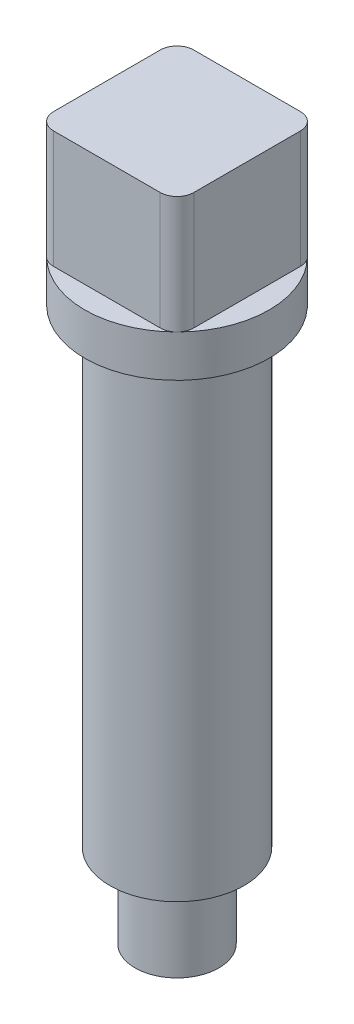
ISO-10303-21;
HEADER;
FILE_DESCRIPTION(('STEP AP214'),'2;1');
FILE_NAME('part.step','',(''),(''),'','','');
FILE_SCHEMA(('AUTOMOTIVE_DESIGN { 1 0 10303 214 1 1 1 1 }'));
ENDSEC;
DATA;
#1=APPLICATION_CONTEXT('core data for automotive mechanical design processes');
#2=APPLICATION_PROTOCOL_DEFINITION('international standard','automotive_design',2000,#1);
#3=PRODUCT_CONTEXT('',#1,'mechanical');
#4=PRODUCT('Part','Part','',(#3));
#5=PRODUCT_RELATED_PRODUCT_CATEGORY('part','',(#4));
#6=PRODUCT_DEFINITION_FORMATION('','',#4);
#7=PRODUCT_DEFINITION_CONTEXT('part definition',#1,'design');
#8=PRODUCT_DEFINITION('design','',#6,#7);
#9=PRODUCT_DEFINITION_SHAPE('','',#8);
#10=(LENGTH_UNIT() NAMED_UNIT(*) SI_UNIT(.MILLI.,.METRE.));
#11=(NAMED_UNIT(*) PLANE_ANGLE_UNIT() SI_UNIT($,.RADIAN.));
#12=(NAMED_UNIT(*) SI_UNIT($,.STERADIAN.) SOLID_ANGLE_UNIT());
#13=UNCERTAINTY_MEASURE_WITH_UNIT(LENGTH_MEASURE(1.E-05),#10,'distance_accuracy_value','');
#14=(GEOMETRIC_REPRESENTATION_CONTEXT(3) GLOBAL_UNCERTAINTY_ASSIGNED_CONTEXT((#13)) GLOBAL_UNIT_ASSIGNED_CONTEXT((#10,
#11,#12)) REPRESENTATION_CONTEXT('',''));
#15=CARTESIAN_POINT('',(0.,0.,0.));
#16=DIRECTION('',(0.,0.,1.));
#17=DIRECTION('',(1.,0.,0.));
#18=AXIS2_PLACEMENT_3D('',#15,#16,#17);
#19=CARTESIAN_POINT('',(11.,71.,0.));
#20=DIRECTION('',(0.,-1.,0.));
#21=DIRECTION('',(1.,0.,0.));
#22=AXIS2_PLACEMENT_3D('',#19,#20,#21);
#23=PLANE('',#22);
#24=CARTESIAN_POINT('',(6.36396103067893,71.,6.36396103067893));
#25=DIRECTION('',(0.,1.,0.));
#26=DIRECTION('',(-1.,0.,0.));
#27=AXIS2_PLACEMENT_3D('',#24,#25,#26);
#28=CIRCLE('',#27,2.);
#29=CARTESIAN_POINT('',(6.36396103067893,71.,8.36396103067893));
#30=VERTEX_POINT('',#29);
#31=CARTESIAN_POINT('',(7.77817459305202,71.,7.77817459305203));
#32=VERTEX_POINT('',#31);
#33=EDGE_CURVE('E63',#30,#32,#28,.T.);
#34=ORIENTED_EDGE('',*,*,#33,.F.);
#35=DIRECTION('',(1.,0.,0.));
#36=VECTOR('',#35,1.);
#37=CARTESIAN_POINT('',(-6.36396103067893,71.,8.36396103067893));
#38=LINE('',#37,#36);
#39=CARTESIAN_POINT('',(-6.36396103067893,71.,8.36396103067893));
#40=VERTEX_POINT('',#39);
#41=EDGE_CURVE('E73',#40,#30,#38,.T.);
#42=ORIENTED_EDGE('',*,*,#41,.F.);
#43=CARTESIAN_POINT('',(-6.36396103067893,71.,6.36396103067893));
#44=DIRECTION('',(0.,1.,0.));
#45=DIRECTION('',(-1.,0.,0.));
#46=AXIS2_PLACEMENT_3D('',#43,#44,#45);
#47=CIRCLE('',#46,2.);
#48=CARTESIAN_POINT('',(-7.77817459305203,71.,7.77817459305202));
#49=VERTEX_POINT('',#48);
#50=EDGE_CURVE('E64',#49,#40,#47,.T.);
#51=ORIENTED_EDGE('',*,*,#50,.F.);
#52=CARTESIAN_POINT('',(0.,71.,0.));
#53=DIRECTION('',(0.,1.,0.));
#54=DIRECTION('',(-1.,0.,0.));
#55=AXIS2_PLACEMENT_3D('',#52,#53,#54);
#56=CIRCLE('',#55,11.);
#57=EDGE_CURVE('E169',#49,#32,#56,.T.);
#58=ORIENTED_EDGE('',*,*,#57,.T.);
#59=EDGE_LOOP('',(#34,#42,#51,#58));
#60=FACE_BOUND('',#59,.T.);
#61=ADVANCED_FACE('F52',(#60),#23,.F.);
#62=CARTESIAN_POINT('',(8.36396103067893,71.,6.36396103067893));
#63=VERTEX_POINT('',#62);
#64=EDGE_CURVE('E11',#32,#63,#28,.T.);
#65=ORIENTED_EDGE('',*,*,#64,.F.);
#66=CARTESIAN_POINT('',(7.77817459305202,71.,-7.77817459305202));
#67=VERTEX_POINT('',#66);
#68=EDGE_CURVE('E173',#32,#67,#56,.T.);
#69=ORIENTED_EDGE('',*,*,#68,.T.);
#70=CARTESIAN_POINT('',(6.36396103067893,71.,-6.36396103067893));
#71=DIRECTION('',(0.,1.,0.));
#72=DIRECTION('',(1.,0.,0.));
#73=AXIS2_PLACEMENT_3D('',#70,#71,#72);
#74=CIRCLE('',#73,2.);
#75=CARTESIAN_POINT('',(8.36396103067893,71.,-6.36396103067893));
#76=VERTEX_POINT('',#75);
#77=EDGE_CURVE('E196',#76,#67,#74,.T.);
#78=ORIENTED_EDGE('',*,*,#77,.F.);
#79=DIRECTION('',(0.,0.,-1.));
#80=VECTOR('',#79,1.);
#81=CARTESIAN_POINT('',(8.36396103067893,71.,-6.36396103067893));
#82=LINE('',#81,#80);
#83=EDGE_CURVE('E152',#63,#76,#82,.T.);
#84=ORIENTED_EDGE('',*,*,#83,.F.);
#85=EDGE_LOOP('',(#65,#69,#78,#84));
#86=FACE_BOUND('',#85,.T.);
#87=ADVANCED_FACE('F267',(#86),#23,.F.);
#88=CARTESIAN_POINT('',(-8.36396103067894,71.,6.36396103067893));
#89=VERTEX_POINT('',#88);
#90=EDGE_CURVE('E214',#89,#49,#47,.T.);
#91=ORIENTED_EDGE('',*,*,#90,.F.);
#92=DIRECTION('',(0.,0.,1.));
#93=VECTOR('',#92,1.);
#94=CARTESIAN_POINT('',(-8.36396103067893,71.,-6.36396103067893));
#95=LINE('',#94,#93);
#96=CARTESIAN_POINT('',(-8.36396103067893,71.,-6.36396103067893));
#97=VERTEX_POINT('',#96);
#98=EDGE_CURVE('E209',#97,#89,#95,.T.);
#99=ORIENTED_EDGE('',*,*,#98,.F.);
#100=CARTESIAN_POINT('',(-6.36396103067893,71.,-6.36396103067893));
#101=DIRECTION('',(0.,1.,0.));
#102=DIRECTION('',(-1.,0.,0.));
#103=AXIS2_PLACEMENT_3D('',#100,#101,#102);
#104=CIRCLE('',#103,2.);
#105=CARTESIAN_POINT('',(-7.77817459305203,71.,-7.77817459305202));
#106=VERTEX_POINT('',#105);
#107=EDGE_CURVE('E198',#106,#97,#104,.T.);
#108=ORIENTED_EDGE('',*,*,#107,.F.);
#109=EDGE_CURVE('E161',#106,#49,#56,.T.);
#110=ORIENTED_EDGE('',*,*,#109,.T.);
#111=EDGE_LOOP('',(#91,#99,#108,#110));
#112=FACE_BOUND('',#111,.T.);
#113=ADVANCED_FACE('F254',(#112),#23,.F.);
#114=CARTESIAN_POINT('',(6.36396103067893,71.,-8.36396103067893));
#115=VERTEX_POINT('',#114);
#116=EDGE_CURVE('E157',#67,#115,#74,.T.);
#117=ORIENTED_EDGE('',*,*,#116,.F.);
#118=EDGE_CURVE('E167',#67,#106,#56,.T.);
#119=ORIENTED_EDGE('',*,*,#118,.T.);
#120=CARTESIAN_POINT('',(-6.36396103067893,71.,-8.36396103067893));
#121=VERTEX_POINT('',#120);
#122=EDGE_CURVE('E205',#121,#106,#104,.T.);
#123=ORIENTED_EDGE('',*,*,#122,.F.);
#124=DIRECTION('',(-1.,0.,0.));
#125=VECTOR('',#124,1.);
#126=CARTESIAN_POINT('',(-6.36396103067893,71.,-8.36396103067893));
#127=LINE('',#126,#125);
#128=EDGE_CURVE('E206',#115,#121,#127,.T.);
#129=ORIENTED_EDGE('',*,*,#128,.F.);
#130=EDGE_LOOP('',(#117,#119,#123,#129));
#131=FACE_BOUND('',#130,.T.);
#132=ADVANCED_FACE('F264',(#131),#23,.F.);
#133=CARTESIAN_POINT('',(0.,0.,0.));
#134=DIRECTION('',(0.,1.,0.));
#135=DIRECTION('',(-1.,0.,0.));
#136=AXIS2_PLACEMENT_3D('',#133,#134,#135);
#137=PLANE('',#136);
#138=CARTESIAN_POINT('',(0.,0.,0.));
#139=DIRECTION('',(0.,1.,0.));
#140=DIRECTION('',(-1.,0.,0.));
#141=AXIS2_PLACEMENT_3D('',#138,#139,#140);
#142=CIRCLE('',#141,5.);
#143=CARTESIAN_POINT('',(-5.,0.,0.));
#144=VERTEX_POINT('',#143);
#145=EDGE_CURVE('E60',#144,#144,#142,.T.);
#146=ORIENTED_EDGE('',*,*,#145,.F.);
#147=EDGE_LOOP('',(#146));
#148=FACE_BOUND('',#147,.T.);
#149=ADVANCED_FACE('F54',(#148),#137,.F.);
#150=CARTESIAN_POINT('',(0.,71.,0.));
#151=DIRECTION('',(0.,1.,0.));
#152=DIRECTION('',(-1.,0.,0.));
#153=AXIS2_PLACEMENT_3D('',#150,#151,#152);
#154=CYLINDRICAL_SURFACE('',#153,5.);
#155=CARTESIAN_POINT('',(0.,10.,0.));
#156=DIRECTION('',(0.,1.,0.));
#157=DIRECTION('',(-1.,0.,0.));
#158=AXIS2_PLACEMENT_3D('',#155,#156,#157);
#159=CIRCLE('',#158,5.00000000000001);
#160=CARTESIAN_POINT('',(-5.00000000000001,10.,0.));
#161=VERTEX_POINT('',#160);
#162=EDGE_CURVE('E187',#161,#161,#159,.T.);
#163=ORIENTED_EDGE('',*,*,#162,.F.);
#164=EDGE_LOOP('',(#163));
#165=FACE_BOUND('',#164,.T.);
#166=ORIENTED_EDGE('',*,*,#145,.T.);
#167=EDGE_LOOP('',(#166));
#168=FACE_BOUND('',#167,.T.);
#169=ADVANCED_FACE('F319',(#165,#168),#154,.T.);
#170=CARTESIAN_POINT('',(5.,10.,0.));
#171=DIRECTION('',(0.,1.,0.));
#172=DIRECTION('',(-1.,0.,0.));
#173=AXIS2_PLACEMENT_3D('',#170,#171,#172);
#174=PLANE('',#173);
#175=CARTESIAN_POINT('',(0.,10.,0.));
#176=DIRECTION('',(0.,1.,0.));
#177=DIRECTION('',(-1.,0.,0.));
#178=AXIS2_PLACEMENT_3D('',#175,#176,#177);
#179=CIRCLE('',#178,8.00000000000001);
#180=CARTESIAN_POINT('',(-8.00000000000001,10.,0.));
#181=VERTEX_POINT('',#180);
#182=EDGE_CURVE('E181',#181,#181,#179,.T.);
#183=ORIENTED_EDGE('',*,*,#182,.F.);
#184=EDGE_LOOP('',(#183));
#185=FACE_BOUND('',#184,.T.);
#186=ORIENTED_EDGE('',*,*,#162,.T.);
#187=EDGE_LOOP('',(#186));
#188=FACE_BOUND('',#187,.T.);
#189=ADVANCED_FACE('F457',(#185,#188),#174,.F.);
#190=CARTESIAN_POINT('',(0.,71.,0.));
#191=DIRECTION('',(0.,1.,0.));
#192=DIRECTION('',(-1.,0.,0.));
#193=AXIS2_PLACEMENT_3D('',#190,#191,#192);
#194=CYLINDRICAL_SURFACE('',#193,8.00000000000001);
#195=CARTESIAN_POINT('',(0.,66.,0.));
#196=DIRECTION('',(0.,1.,0.));
#197=DIRECTION('',(-1.,0.,0.));
#198=AXIS2_PLACEMENT_3D('',#195,#196,#197);
#199=CIRCLE('',#198,8.00000000000001);
#200=CARTESIAN_POINT('',(-8.00000000000001,66.,0.));
#201=VERTEX_POINT('',#200);
#202=EDGE_CURVE('E178',#201,#201,#199,.T.);
#203=ORIENTED_EDGE('',*,*,#202,.F.);
#204=EDGE_LOOP('',(#203));
#205=FACE_BOUND('',#204,.T.);
#206=ORIENTED_EDGE('',*,*,#182,.T.);
#207=EDGE_LOOP('',(#206));
#208=FACE_BOUND('',#207,.T.);
#209=ADVANCED_FACE('F443',(#205,#208),#194,.T.);
#210=CARTESIAN_POINT('',(8.00000000000001,66.,0.));
#211=DIRECTION('',(0.,1.,0.));
#212=DIRECTION('',(-1.,0.,0.));
#213=AXIS2_PLACEMENT_3D('',#210,#211,#212);
#214=PLANE('',#213);
#215=CARTESIAN_POINT('',(0.,66.,0.));
#216=DIRECTION('',(0.,1.,0.));
#217=DIRECTION('',(-1.,0.,0.));
#218=AXIS2_PLACEMENT_3D('',#215,#216,#217);
#219=CIRCLE('',#218,11.);
#220=CARTESIAN_POINT('',(-11.,66.,0.));
#221=VERTEX_POINT('',#220);
#222=EDGE_CURVE('E171',#221,#221,#219,.T.);
#223=ORIENTED_EDGE('',*,*,#222,.F.);
#224=EDGE_LOOP('',(#223));
#225=FACE_BOUND('',#224,.T.);
#226=ORIENTED_EDGE('',*,*,#202,.T.);
#227=EDGE_LOOP('',(#226));
#228=FACE_BOUND('',#227,.T.);
#229=ADVANCED_FACE('F427',(#225,#228),#214,.F.);
#230=CARTESIAN_POINT('',(0.,71.,0.));
#231=DIRECTION('',(0.,1.,0.));
#232=DIRECTION('',(-1.,0.,0.));
#233=AXIS2_PLACEMENT_3D('',#230,#231,#232);
#234=CYLINDRICAL_SURFACE('',#233,11.);
#235=ORIENTED_EDGE('',*,*,#57,.F.);
#236=ORIENTED_EDGE('',*,*,#109,.F.);
#237=ORIENTED_EDGE('',*,*,#118,.F.);
#238=ORIENTED_EDGE('',*,*,#68,.F.);
#239=EDGE_LOOP('',(#235,#236,#237,#238));
#240=FACE_BOUND('',#239,.T.);
#241=ORIENTED_EDGE('',*,*,#222,.T.);
#242=EDGE_LOOP('',(#241));
#243=FACE_BOUND('',#242,.T.);
#244=ADVANCED_FACE('F257',(#240,#243),#234,.T.);
#245=CARTESIAN_POINT('',(6.36396103067892,85.,-6.36396103067893));
#246=DIRECTION('',(0.,-1.,0.));
#247=DIRECTION('',(1.,0.,0.));
#248=AXIS2_PLACEMENT_3D('',#245,#246,#247);
#249=CYLINDRICAL_SURFACE('',#248,2.);
#250=ORIENTED_EDGE('',*,*,#77,.T.);
#251=ORIENTED_EDGE('',*,*,#116,.T.);
#252=DIRECTION('',(0.,-1.,0.));
#253=VECTOR('',#252,1.);
#254=CARTESIAN_POINT('',(6.36396103067892,85.,-8.36396103067893));
#255=LINE('',#254,#253);
#256=CARTESIAN_POINT('',(6.36396103067892,85.,-8.36396103067893));
#257=VERTEX_POINT('',#256);
#258=EDGE_CURVE('E140',#257,#115,#255,.T.);
#259=ORIENTED_EDGE('',*,*,#258,.F.);
#260=CARTESIAN_POINT('',(6.36396103067892,85.,-6.36396103067893));
#261=DIRECTION('',(0.,1.,0.));
#262=DIRECTION('',(1.,0.,0.));
#263=AXIS2_PLACEMENT_3D('',#260,#261,#262);
#264=CIRCLE('',#263,2.);
#265=CARTESIAN_POINT('',(8.36396103067893,85.,-6.36396103067893));
#266=VERTEX_POINT('',#265);
#267=EDGE_CURVE('E145',#266,#257,#264,.T.);
#268=ORIENTED_EDGE('',*,*,#267,.F.);
#269=DIRECTION('',(0.,-1.,0.));
#270=VECTOR('',#269,1.);
#271=CARTESIAN_POINT('',(8.36396103067893,85.,-6.36396103067893));
#272=LINE('',#271,#270);
#273=EDGE_CURVE('E223',#266,#76,#272,.T.);
#274=ORIENTED_EDGE('',*,*,#273,.T.);
#275=EDGE_LOOP('',(#250,#251,#259,#268,#274));
#276=FACE_BOUND('',#275,.T.);
#277=ADVANCED_FACE('F158',(#276),#249,.T.);
#278=CARTESIAN_POINT('',(-6.36396103067893,85.,-8.36396103067893));
#279=DIRECTION('',(0.,0.,1.));
#280=DIRECTION('',(1.,0.,0.));
#281=AXIS2_PLACEMENT_3D('',#278,#279,#280);
#282=PLANE('',#281);
#283=ORIENTED_EDGE('',*,*,#128,.T.);
#284=DIRECTION('',(0.,-1.,0.));
#285=VECTOR('',#284,1.);
#286=CARTESIAN_POINT('',(-6.36396103067893,85.,-8.36396103067893));
#287=LINE('',#286,#285);
#288=CARTESIAN_POINT('',(-6.36396103067893,85.,-8.36396103067893));
#289=VERTEX_POINT('',#288);
#290=EDGE_CURVE('E138',#289,#121,#287,.T.);
#291=ORIENTED_EDGE('',*,*,#290,.F.);
#292=DIRECTION('',(-1.,0.,0.));
#293=VECTOR('',#292,1.);
#294=CARTESIAN_POINT('',(-6.36396103067893,85.,-8.36396103067893));
#295=LINE('',#294,#293);
#296=EDGE_CURVE('E135',#257,#289,#295,.T.);
#297=ORIENTED_EDGE('',*,*,#296,.F.);
#298=ORIENTED_EDGE('',*,*,#258,.T.);
#299=EDGE_LOOP('',(#283,#291,#297,#298));
#300=FACE_BOUND('',#299,.T.);
#301=ADVANCED_FACE('F133',(#300),#282,.F.);
#302=CARTESIAN_POINT('',(-6.36396103067893,85.,-6.36396103067893));
#303=DIRECTION('',(0.,-1.,0.));
#304=DIRECTION('',(1.,0.,0.));
#305=AXIS2_PLACEMENT_3D('',#302,#303,#304);
#306=CYLINDRICAL_SURFACE('',#305,2.);
#307=ORIENTED_EDGE('',*,*,#122,.T.);
#308=ORIENTED_EDGE('',*,*,#107,.T.);
#309=DIRECTION('',(0.,-1.,0.));
#310=VECTOR('',#309,1.);
#311=CARTESIAN_POINT('',(-8.36396103067893,85.,-6.36396103067893));
#312=LINE('',#311,#310);
#313=CARTESIAN_POINT('',(-8.36396103067893,85.,-6.36396103067893));
#314=VERTEX_POINT('',#313);
#315=EDGE_CURVE('E166',#314,#97,#312,.T.);
#316=ORIENTED_EDGE('',*,*,#315,.F.);
#317=CARTESIAN_POINT('',(-6.36396103067893,85.,-6.36396103067893));
#318=DIRECTION('',(0.,1.,0.));
#319=DIRECTION('',(-1.,0.,0.));
#320=AXIS2_PLACEMENT_3D('',#317,#318,#319);
#321=CIRCLE('',#320,2.);
#322=EDGE_CURVE('E141',#289,#314,#321,.T.);
#323=ORIENTED_EDGE('',*,*,#322,.F.);
#324=ORIENTED_EDGE('',*,*,#290,.T.);
#325=EDGE_LOOP('',(#307,#308,#316,#323,#324));
#326=FACE_BOUND('',#325,.T.);
#327=ADVANCED_FACE('F252',(#326),#306,.T.);
#328=CARTESIAN_POINT('',(-8.36396103067893,85.,-6.36396103067893));
#329=DIRECTION('',(1.,0.,0.));
#330=DIRECTION('',(0.,0.,-1.));
#331=AXIS2_PLACEMENT_3D('',#328,#329,#330);
#332=PLANE('',#331);
#333=ORIENTED_EDGE('',*,*,#98,.T.);
#334=DIRECTION('',(0.,-1.,0.));
#335=VECTOR('',#334,1.);
#336=CARTESIAN_POINT('',(-8.36396103067894,85.,6.36396103067893));
#337=LINE('',#336,#335);
#338=CARTESIAN_POINT('',(-8.36396103067894,85.,6.36396103067893));
#339=VERTEX_POINT('',#338);
#340=EDGE_CURVE('E238',#339,#89,#337,.T.);
#341=ORIENTED_EDGE('',*,*,#340,.F.);
#342=DIRECTION('',(0.,0.,1.));
#343=VECTOR('',#342,1.);
#344=CARTESIAN_POINT('',(-8.36396103067893,85.,-6.36396103067893));
#345=LINE('',#344,#343);
#346=EDGE_CURVE('E249',#314,#339,#345,.T.);
#347=ORIENTED_EDGE('',*,*,#346,.F.);
#348=ORIENTED_EDGE('',*,*,#315,.T.);
#349=EDGE_LOOP('',(#333,#341,#347,#348));
#350=FACE_BOUND('',#349,.T.);
#351=ADVANCED_FACE('F247',(#350),#332,.F.);
#352=CARTESIAN_POINT('',(-6.36396103067894,85.,6.36396103067893));
#353=DIRECTION('',(0.,-1.,0.));
#354=DIRECTION('',(1.,0.,0.));
#355=AXIS2_PLACEMENT_3D('',#352,#353,#354);
#356=CYLINDRICAL_SURFACE('',#355,2.);
#357=ORIENTED_EDGE('',*,*,#90,.T.);
#358=ORIENTED_EDGE('',*,*,#50,.T.);
#359=DIRECTION('',(0.,-1.,0.));
#360=VECTOR('',#359,1.);
#361=CARTESIAN_POINT('',(-6.36396103067894,85.,8.36396103067893));
#362=LINE('',#361,#360);
#363=CARTESIAN_POINT('',(-6.36396103067894,85.,8.36396103067893));
#364=VERTEX_POINT('',#363);
#365=EDGE_CURVE('E237',#364,#40,#362,.T.);
#366=ORIENTED_EDGE('',*,*,#365,.F.);
#367=CARTESIAN_POINT('',(-6.36396103067894,85.,6.36396103067893));
#368=DIRECTION('',(0.,1.,0.));
#369=DIRECTION('',(-1.,0.,0.));
#370=AXIS2_PLACEMENT_3D('',#367,#368,#369);
#371=CIRCLE('',#370,2.);
#372=EDGE_CURVE('E281',#339,#364,#371,.T.);
#373=ORIENTED_EDGE('',*,*,#372,.F.);
#374=ORIENTED_EDGE('',*,*,#340,.T.);
#375=EDGE_LOOP('',(#357,#358,#366,#373,#374));
#376=FACE_BOUND('',#375,.T.);
#377=ADVANCED_FACE('F284',(#376),#356,.T.);
#378=CARTESIAN_POINT('',(-6.36396103067894,85.,8.36396103067893));
#379=DIRECTION('',(0.,0.,-1.));
#380=DIRECTION('',(-1.,0.,0.));
#381=AXIS2_PLACEMENT_3D('',#378,#379,#380);
#382=PLANE('',#381);
#383=ORIENTED_EDGE('',*,*,#41,.T.);
#384=DIRECTION('',(0.,-1.,0.));
#385=VECTOR('',#384,1.);
#386=CARTESIAN_POINT('',(6.36396103067892,85.,8.36396103067893));
#387=LINE('',#386,#385);
#388=CARTESIAN_POINT('',(6.36396103067892,85.,8.36396103067893));
#389=VERTEX_POINT('',#388);
#390=EDGE_CURVE('E235',#389,#30,#387,.T.);
#391=ORIENTED_EDGE('',*,*,#390,.F.);
#392=DIRECTION('',(1.,0.,0.));
#393=VECTOR('',#392,1.);
#394=CARTESIAN_POINT('',(-6.36396103067894,85.,8.36396103067893));
#395=LINE('',#394,#393);
#396=EDGE_CURVE('E276',#364,#389,#395,.T.);
#397=ORIENTED_EDGE('',*,*,#396,.F.);
#398=ORIENTED_EDGE('',*,*,#365,.T.);
#399=EDGE_LOOP('',(#383,#391,#397,#398));
#400=FACE_BOUND('',#399,.T.);
#401=ADVANCED_FACE('F279',(#400),#382,.F.);
#402=CARTESIAN_POINT('',(6.36396103067892,85.,6.36396103067893));
#403=DIRECTION('',(0.,-1.,0.));
#404=DIRECTION('',(1.,0.,0.));
#405=AXIS2_PLACEMENT_3D('',#402,#403,#404);
#406=CYLINDRICAL_SURFACE('',#405,2.);
#407=ORIENTED_EDGE('',*,*,#33,.T.);
#408=ORIENTED_EDGE('',*,*,#64,.T.);
#409=DIRECTION('',(0.,-1.,0.));
#410=VECTOR('',#409,1.);
#411=CARTESIAN_POINT('',(8.36396103067893,85.,6.36396103067893));
#412=LINE('',#411,#410);
#413=CARTESIAN_POINT('',(8.36396103067893,85.,6.36396103067893));
#414=VERTEX_POINT('',#413);
#415=EDGE_CURVE('E229',#414,#63,#412,.T.);
#416=ORIENTED_EDGE('',*,*,#415,.F.);
#417=CARTESIAN_POINT('',(6.36396103067892,85.,6.36396103067893));
#418=DIRECTION('',(0.,1.,0.));
#419=DIRECTION('',(-1.,0.,0.));
#420=AXIS2_PLACEMENT_3D('',#417,#418,#419);
#421=CIRCLE('',#420,2.);
#422=EDGE_CURVE('E274',#389,#414,#421,.T.);
#423=ORIENTED_EDGE('',*,*,#422,.F.);
#424=ORIENTED_EDGE('',*,*,#390,.T.);
#425=EDGE_LOOP('',(#407,#408,#416,#423,#424));
#426=FACE_BOUND('',#425,.T.);
#427=ADVANCED_FACE('F271',(#426),#406,.T.);
#428=CARTESIAN_POINT('',(8.36396103067893,85.,-6.36396103067893));
#429=DIRECTION('',(-1.,0.,0.));
#430=DIRECTION('',(0.,-1.,0.));
#431=AXIS2_PLACEMENT_3D('',#428,#429,#430);
#432=PLANE('',#431);
#433=ORIENTED_EDGE('',*,*,#83,.T.);
#434=ORIENTED_EDGE('',*,*,#273,.F.);
#435=DIRECTION('',(0.,0.,-1.));
#436=VECTOR('',#435,1.);
#437=CARTESIAN_POINT('',(8.36396103067893,85.,-6.36396103067893));
#438=LINE('',#437,#436);
#439=EDGE_CURVE('E149',#414,#266,#438,.T.);
#440=ORIENTED_EDGE('',*,*,#439,.F.);
#441=ORIENTED_EDGE('',*,*,#415,.T.);
#442=EDGE_LOOP('',(#433,#434,#440,#441));
#443=FACE_BOUND('',#442,.T.);
#444=ADVANCED_FACE('F300',(#443),#432,.F.);
#445=CARTESIAN_POINT('',(6.36396103067892,85.,-6.36396103067893));
#446=DIRECTION('',(0.,-1.,0.));
#447=DIRECTION('',(1.,0.,0.));
#448=AXIS2_PLACEMENT_3D('',#445,#446,#447);
#449=PLANE('',#448);
#450=ORIENTED_EDGE('',*,*,#267,.T.);
#451=ORIENTED_EDGE('',*,*,#296,.T.);
#452=ORIENTED_EDGE('',*,*,#322,.T.);
#453=ORIENTED_EDGE('',*,*,#346,.T.);
#454=ORIENTED_EDGE('',*,*,#372,.T.);
#455=ORIENTED_EDGE('',*,*,#396,.T.);
#456=ORIENTED_EDGE('',*,*,#422,.T.);
#457=ORIENTED_EDGE('',*,*,#439,.T.);
#458=EDGE_LOOP('',(#450,#451,#452,#453,#454,#455,#456,#457));
#459=FACE_BOUND('',#458,.T.);
#460=ADVANCED_FACE('F150',(#459),#449,.F.);
#461=CLOSED_SHELL('',(#61,#87,#113,#132,#149,#169,#189,#209,#229,#244,#277,#301,#327,#351,#377,
#401,#427,#444,#460));
#462=MANIFOLD_SOLID_BREP('B2',#461);
#463=ADVANCED_BREP_SHAPE_REPRESENTATION('',(#18,#462),#14);
#464=SHAPE_DEFINITION_REPRESENTATION(#9,#463);
ENDSEC;
END-ISO-10303-21;
